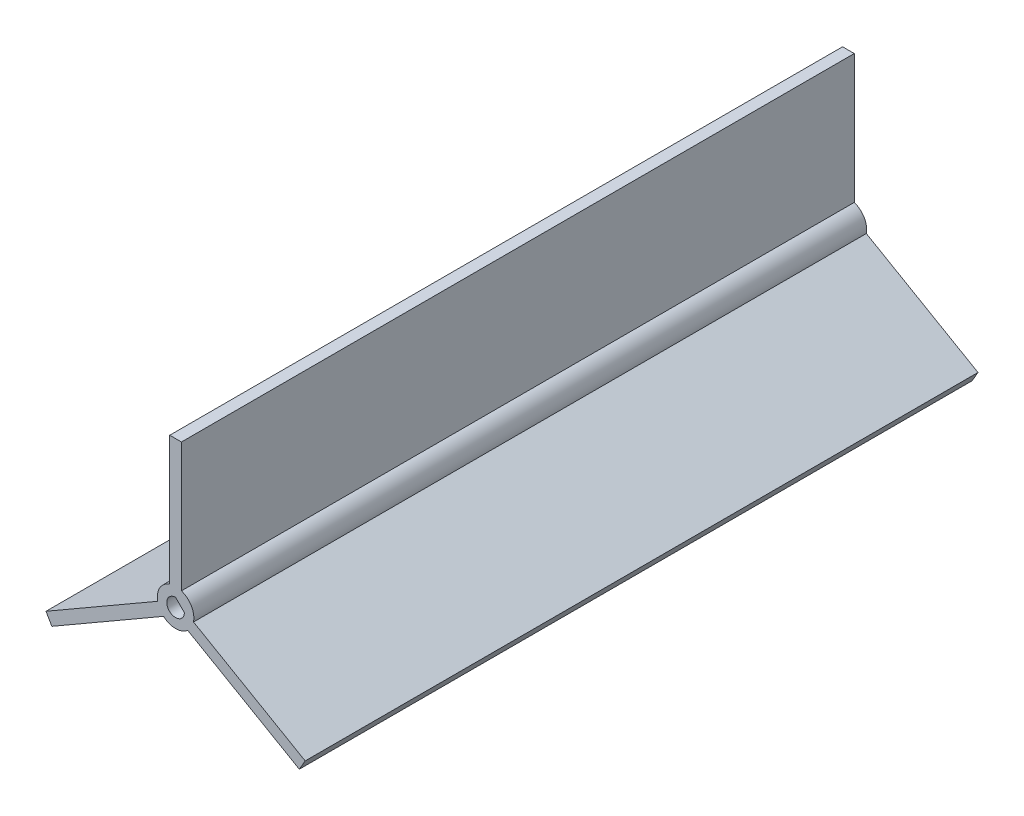
ISO-10303-21;
HEADER;
FILE_DESCRIPTION(('STEP AP214'),'2;1');
FILE_NAME('part.step','',(''),(''),'','','');
FILE_SCHEMA(('AUTOMOTIVE_DESIGN { 1 0 10303 214 1 1 1 1 }'));
ENDSEC;
DATA;
#1=APPLICATION_CONTEXT('core data for automotive mechanical design processes');
#2=APPLICATION_PROTOCOL_DEFINITION('international standard','automotive_design',2000,#1);
#3=PRODUCT_CONTEXT('',#1,'mechanical');
#4=PRODUCT('Part','Part','',(#3));
#5=PRODUCT_RELATED_PRODUCT_CATEGORY('part','',(#4));
#6=PRODUCT_DEFINITION_FORMATION('','',#4);
#7=PRODUCT_DEFINITION_CONTEXT('part definition',#1,'design');
#8=PRODUCT_DEFINITION('design','',#6,#7);
#9=PRODUCT_DEFINITION_SHAPE('','',#8);
#10=(LENGTH_UNIT() NAMED_UNIT(*) SI_UNIT(.MILLI.,.METRE.));
#11=(NAMED_UNIT(*) PLANE_ANGLE_UNIT() SI_UNIT($,.RADIAN.));
#12=(NAMED_UNIT(*) SI_UNIT($,.STERADIAN.) SOLID_ANGLE_UNIT());
#13=UNCERTAINTY_MEASURE_WITH_UNIT(LENGTH_MEASURE(1.E-05),#10,'distance_accuracy_value','');
#14=(GEOMETRIC_REPRESENTATION_CONTEXT(3) GLOBAL_UNCERTAINTY_ASSIGNED_CONTEXT((#13)) GLOBAL_UNIT_ASSIGNED_CONTEXT((#10,
#11,#12)) REPRESENTATION_CONTEXT('',''));
#15=CARTESIAN_POINT('',(0.,0.,0.));
#16=DIRECTION('',(0.,0.,1.));
#17=DIRECTION('',(1.,0.,0.));
#18=AXIS2_PLACEMENT_3D('',#15,#16,#17);
#19=CARTESIAN_POINT('',(-1.27000000000001,2.19970452561247,292.1));
#20=DIRECTION('',(0.500000000000004,-0.866025403784436,0.));
#21=DIRECTION('',(0.866025403784436,0.500000000000004,0.));
#22=AXIS2_PLACEMENT_3D('',#19,#20,#21);
#23=PLANE('',#22);
#24=DIRECTION('',(-0.866025403784436,-0.500000000000004,0.));
#25=VECTOR('',#24,1.);
#26=CARTESIAN_POINT('',(-1.27000000000001,2.19970452561247,0.));
#27=LINE('',#26,#25);
#28=CARTESIAN_POINT('',(-7.7826208002232,-1.56035884652639,0.));
#29=VERTEX_POINT('',#28);
#30=CARTESIAN_POINT('',(-56.2626131403117,-29.5502954743878,0.));
#31=VERTEX_POINT('',#30);
#32=EDGE_CURVE('E158',#29,#31,#27,.T.);
#33=ORIENTED_EDGE('',*,*,#32,.T.);
#34=DIRECTION('',(0.,0.,-1.));
#35=VECTOR('',#34,1.);
#36=CARTESIAN_POINT('',(-56.2626131403117,-29.5502954743878,292.1));
#37=LINE('',#36,#35);
#38=CARTESIAN_POINT('',(-56.2626131403117,-29.5502954743878,292.1));
#39=VERTEX_POINT('',#38);
#40=EDGE_CURVE('E11',#39,#31,#37,.T.);
#41=ORIENTED_EDGE('',*,*,#40,.F.);
#42=DIRECTION('',(-0.866025403784436,-0.500000000000004,0.));
#43=VECTOR('',#42,1.);
#44=CARTESIAN_POINT('',(-1.27000000000001,2.19970452561247,292.1));
#45=LINE('',#44,#43);
#46=CARTESIAN_POINT('',(-7.7826208002232,-1.56035884652639,292.1));
#47=VERTEX_POINT('',#46);
#48=EDGE_CURVE('E152',#47,#39,#45,.T.);
#49=ORIENTED_EDGE('',*,*,#48,.F.);
#50=DIRECTION('',(0.,0.,-1.));
#51=VECTOR('',#50,1.);
#52=CARTESIAN_POINT('',(-7.7826208002232,-1.56035884652639,292.1));
#53=LINE('',#52,#51);
#54=EDGE_CURVE('E146',#47,#29,#53,.T.);
#55=ORIENTED_EDGE('',*,*,#54,.T.);
#56=EDGE_LOOP('',(#33,#41,#49,#55));
#57=FACE_BOUND('',#56,.T.);
#58=ADVANCED_FACE('F36',(#57),#23,.F.);
#59=CARTESIAN_POINT('',(-54.9926131403117,-31.7500000000004,292.1));
#60=DIRECTION('',(0.866025403784436,0.500000000000005,0.));
#61=DIRECTION('',(-0.500000000000005,0.866025403784436,0.));
#62=AXIS2_PLACEMENT_3D('',#59,#60,#61);
#63=PLANE('',#62);
#64=DIRECTION('',(0.500000000000005,-0.866025403784436,0.));
#65=VECTOR('',#64,1.);
#66=CARTESIAN_POINT('',(-54.9926131403117,-31.7500000000004,0.));
#67=LINE('',#66,#65);
#68=CARTESIAN_POINT('',(-53.7226131403117,-33.9497045256128,0.));
#69=VERTEX_POINT('',#68);
#70=EDGE_CURVE('E165',#31,#69,#67,.T.);
#71=ORIENTED_EDGE('',*,*,#70,.T.);
#72=DIRECTION('',(0.,0.,-1.));
#73=VECTOR('',#72,1.);
#74=CARTESIAN_POINT('',(-53.7226131403117,-33.9497045256128,292.1));
#75=LINE('',#74,#73);
#76=CARTESIAN_POINT('',(-53.7226131403117,-33.9497045256128,292.1));
#77=VERTEX_POINT('',#76);
#78=EDGE_CURVE('E44',#77,#69,#75,.T.);
#79=ORIENTED_EDGE('',*,*,#78,.F.);
#80=DIRECTION('',(0.500000000000005,-0.866025403784436,0.));
#81=VECTOR('',#80,1.);
#82=CARTESIAN_POINT('',(-54.9926131403117,-31.7500000000004,292.1));
#83=LINE('',#82,#81);
#84=EDGE_CURVE('E220',#39,#77,#83,.T.);
#85=ORIENTED_EDGE('',*,*,#84,.F.);
#86=ORIENTED_EDGE('',*,*,#40,.T.);
#87=EDGE_LOOP('',(#71,#79,#85,#86));
#88=FACE_BOUND('',#87,.T.);
#89=ADVANCED_FACE('F286',(#88),#63,.F.);
#90=CARTESIAN_POINT('',(1.27000000000001,-2.19970452561247,292.1));
#91=DIRECTION('',(0.500000000000004,-0.866025403784436,0.));
#92=DIRECTION('',(0.866025403784436,0.500000000000004,0.));
#93=AXIS2_PLACEMENT_3D('',#90,#91,#92);
#94=PLANE('',#93);
#95=DIRECTION('',(-0.866025403784436,-0.500000000000004,0.));
#96=VECTOR('',#95,1.);
#97=CARTESIAN_POINT('',(1.27000000000001,-2.19970452561247,0.));
#98=LINE('',#97,#96);
#99=CARTESIAN_POINT('',(-5.24262080022318,-5.95976789775133,0.));
#100=VERTEX_POINT('',#99);
#101=EDGE_CURVE('E167',#100,#69,#98,.T.);
#102=ORIENTED_EDGE('',*,*,#101,.F.);
#103=DIRECTION('',(0.,0.,-1.));
#104=VECTOR('',#103,1.);
#105=CARTESIAN_POINT('',(-5.24262080022318,-5.95976789775133,292.1));
#106=LINE('',#105,#104);
#107=CARTESIAN_POINT('',(-5.24262080022318,-5.95976789775133,292.1));
#108=VERTEX_POINT('',#107);
#109=EDGE_CURVE('E210',#108,#100,#106,.T.);
#110=ORIENTED_EDGE('',*,*,#109,.F.);
#111=DIRECTION('',(-0.866025403784436,-0.500000000000004,0.));
#112=VECTOR('',#111,1.);
#113=CARTESIAN_POINT('',(1.27000000000001,-2.19970452561247,292.1));
#114=LINE('',#113,#112);
#115=EDGE_CURVE('E222',#108,#77,#114,.T.);
#116=ORIENTED_EDGE('',*,*,#115,.T.);
#117=ORIENTED_EDGE('',*,*,#78,.T.);
#118=EDGE_LOOP('',(#102,#110,#116,#117));
#119=FACE_BOUND('',#118,.T.);
#120=ADVANCED_FACE('F283',(#119),#94,.T.);
#121=CARTESIAN_POINT('',(0.,0.,292.1));
#122=DIRECTION('',(0.,0.,-1.));
#123=DIRECTION('',(-1.,0.,0.));
#124=AXIS2_PLACEMENT_3D('',#121,#122,#123);
#125=CYLINDRICAL_SURFACE('',#124,7.9375);
#126=CARTESIAN_POINT('',(0.,0.,0.));
#127=DIRECTION('',(0.,0.,1.));
#128=DIRECTION('',(1.,0.,0.));
#129=AXIS2_PLACEMENT_3D('',#126,#127,#128);
#130=CIRCLE('',#129,7.9375);
#131=CARTESIAN_POINT('',(5.24262080022318,-5.95976789775133,0.));
#132=VERTEX_POINT('',#131);
#133=EDGE_CURVE('E173',#100,#132,#130,.T.);
#134=ORIENTED_EDGE('',*,*,#133,.T.);
#135=DIRECTION('',(0.,0.,-1.));
#136=VECTOR('',#135,1.);
#137=CARTESIAN_POINT('',(5.24262080022318,-5.95976789775133,292.1));
#138=LINE('',#137,#136);
#139=CARTESIAN_POINT('',(5.24262080022318,-5.95976789775133,292.1));
#140=VERTEX_POINT('',#139);
#141=EDGE_CURVE('E207',#140,#132,#138,.T.);
#142=ORIENTED_EDGE('',*,*,#141,.F.);
#143=CARTESIAN_POINT('',(0.,0.,292.1));
#144=DIRECTION('',(0.,0.,1.));
#145=DIRECTION('',(1.,0.,0.));
#146=AXIS2_PLACEMENT_3D('',#143,#144,#145);
#147=CIRCLE('',#146,7.9375);
#148=EDGE_CURVE('E225',#108,#140,#147,.T.);
#149=ORIENTED_EDGE('',*,*,#148,.F.);
#150=ORIENTED_EDGE('',*,*,#109,.T.);
#151=EDGE_LOOP('',(#134,#142,#149,#150));
#152=FACE_BOUND('',#151,.T.);
#153=ADVANCED_FACE('F279',(#152),#125,.T.);
#154=CARTESIAN_POINT('',(-1.27000000000001,-2.19970452561247,292.1));
#155=DIRECTION('',(0.500000000000004,0.866025403784436,0.));
#156=DIRECTION('',(-0.866025403784436,0.500000000000004,0.));
#157=AXIS2_PLACEMENT_3D('',#154,#155,#156);
#158=PLANE('',#157);
#159=DIRECTION('',(0.866025403784436,-0.500000000000004,0.));
#160=VECTOR('',#159,1.);
#161=CARTESIAN_POINT('',(-1.27000000000001,-2.19970452561247,0.));
#162=LINE('',#161,#160);
#163=CARTESIAN_POINT('',(53.7226131403117,-33.9497045256127,0.));
#164=VERTEX_POINT('',#163);
#165=EDGE_CURVE('E175',#132,#164,#162,.T.);
#166=ORIENTED_EDGE('',*,*,#165,.T.);
#167=DIRECTION('',(0.,0.,-1.));
#168=VECTOR('',#167,1.);
#169=CARTESIAN_POINT('',(53.7226131403117,-33.9497045256127,292.1));
#170=LINE('',#169,#168);
#171=CARTESIAN_POINT('',(53.7226131403117,-33.9497045256127,292.1));
#172=VERTEX_POINT('',#171);
#173=EDGE_CURVE('E205',#172,#164,#170,.T.);
#174=ORIENTED_EDGE('',*,*,#173,.F.);
#175=DIRECTION('',(0.866025403784436,-0.500000000000004,0.));
#176=VECTOR('',#175,1.);
#177=CARTESIAN_POINT('',(-1.27000000000001,-2.19970452561247,292.1));
#178=LINE('',#177,#176);
#179=EDGE_CURVE('E227',#140,#172,#178,.T.);
#180=ORIENTED_EDGE('',*,*,#179,.F.);
#181=ORIENTED_EDGE('',*,*,#141,.T.);
#182=EDGE_LOOP('',(#166,#174,#180,#181));
#183=FACE_BOUND('',#182,.T.);
#184=ADVANCED_FACE('F275',(#183),#158,.F.);
#185=CARTESIAN_POINT('',(54.9926131403117,-31.7500000000002,292.1));
#186=DIRECTION('',(0.866025403784437,-0.500000000000003,0.));
#187=DIRECTION('',(0.500000000000003,0.866025403784437,0.));
#188=AXIS2_PLACEMENT_3D('',#185,#186,#187);
#189=PLANE('',#188);
#190=DIRECTION('',(-0.500000000000003,-0.866025403784437,0.));
#191=VECTOR('',#190,1.);
#192=CARTESIAN_POINT('',(54.9926131403117,-31.7500000000002,0.));
#193=LINE('',#192,#191);
#194=CARTESIAN_POINT('',(56.2626131403117,-29.5502954743878,0.));
#195=VERTEX_POINT('',#194);
#196=EDGE_CURVE('E178',#195,#164,#193,.T.);
#197=ORIENTED_EDGE('',*,*,#196,.F.);
#198=DIRECTION('',(0.,0.,-1.));
#199=VECTOR('',#198,1.);
#200=CARTESIAN_POINT('',(56.2626131403117,-29.5502954743878,292.1));
#201=LINE('',#200,#199);
#202=CARTESIAN_POINT('',(56.2626131403117,-29.5502954743878,292.1));
#203=VERTEX_POINT('',#202);
#204=EDGE_CURVE('E203',#203,#195,#201,.T.);
#205=ORIENTED_EDGE('',*,*,#204,.F.);
#206=DIRECTION('',(-0.500000000000003,-0.866025403784437,0.));
#207=VECTOR('',#206,1.);
#208=CARTESIAN_POINT('',(54.9926131403117,-31.7500000000002,292.1));
#209=LINE('',#208,#207);
#210=EDGE_CURVE('E229',#203,#172,#209,.T.);
#211=ORIENTED_EDGE('',*,*,#210,.T.);
#212=ORIENTED_EDGE('',*,*,#173,.T.);
#213=EDGE_LOOP('',(#197,#205,#211,#212));
#214=FACE_BOUND('',#213,.T.);
#215=ADVANCED_FACE('F270',(#214),#189,.T.);
#216=CARTESIAN_POINT('',(1.27000000000001,2.19970452561247,292.1));
#217=DIRECTION('',(0.500000000000004,0.866025403784436,0.));
#218=DIRECTION('',(-0.866025403784436,0.500000000000004,0.));
#219=AXIS2_PLACEMENT_3D('',#216,#217,#218);
#220=PLANE('',#219);
#221=DIRECTION('',(0.866025403784436,-0.500000000000004,0.));
#222=VECTOR('',#221,1.);
#223=CARTESIAN_POINT('',(1.27000000000001,2.19970452561247,0.));
#224=LINE('',#223,#222);
#225=CARTESIAN_POINT('',(7.7826208002232,-1.56035884652639,0.));
#226=VERTEX_POINT('',#225);
#227=EDGE_CURVE('E181',#226,#195,#224,.T.);
#228=ORIENTED_EDGE('',*,*,#227,.F.);
#229=DIRECTION('',(0.,0.,-1.));
#230=VECTOR('',#229,1.);
#231=CARTESIAN_POINT('',(7.7826208002232,-1.56035884652639,292.1));
#232=LINE('',#231,#230);
#233=CARTESIAN_POINT('',(7.7826208002232,-1.56035884652639,292.1));
#234=VERTEX_POINT('',#233);
#235=EDGE_CURVE('E201',#234,#226,#232,.T.);
#236=ORIENTED_EDGE('',*,*,#235,.F.);
#237=DIRECTION('',(0.866025403784436,-0.500000000000004,0.));
#238=VECTOR('',#237,1.);
#239=CARTESIAN_POINT('',(1.27000000000001,2.19970452561247,292.1));
#240=LINE('',#239,#238);
#241=EDGE_CURVE('E232',#234,#203,#240,.T.);
#242=ORIENTED_EDGE('',*,*,#241,.T.);
#243=ORIENTED_EDGE('',*,*,#204,.T.);
#244=EDGE_LOOP('',(#228,#236,#242,#243));
#245=FACE_BOUND('',#244,.T.);
#246=ADVANCED_FACE('F265',(#245),#220,.T.);
#247=CARTESIAN_POINT('',(0.,0.,292.1));
#248=DIRECTION('',(0.,0.,-1.));
#249=DIRECTION('',(-1.,0.,0.));
#250=AXIS2_PLACEMENT_3D('',#247,#248,#249);
#251=CYLINDRICAL_SURFACE('',#250,7.9375);
#252=CARTESIAN_POINT('',(0.,0.,0.));
#253=DIRECTION('',(0.,0.,1.));
#254=DIRECTION('',(1.,0.,0.));
#255=AXIS2_PLACEMENT_3D('',#252,#253,#254);
#256=CIRCLE('',#255,7.9375);
#257=CARTESIAN_POINT('',(2.54,7.52012674427765,0.));
#258=VERTEX_POINT('',#257);
#259=EDGE_CURVE('E184',#226,#258,#256,.T.);
#260=ORIENTED_EDGE('',*,*,#259,.T.);
#261=DIRECTION('',(0.,0.,-1.));
#262=VECTOR('',#261,1.);
#263=CARTESIAN_POINT('',(2.54,7.52012674427765,292.1));
#264=LINE('',#263,#262);
#265=CARTESIAN_POINT('',(2.54,7.52012674427765,292.1));
#266=VERTEX_POINT('',#265);
#267=EDGE_CURVE('E198',#266,#258,#264,.T.);
#268=ORIENTED_EDGE('',*,*,#267,.F.);
#269=CARTESIAN_POINT('',(0.,0.,292.1));
#270=DIRECTION('',(0.,0.,1.));
#271=DIRECTION('',(1.,0.,0.));
#272=AXIS2_PLACEMENT_3D('',#269,#270,#271);
#273=CIRCLE('',#272,7.9375);
#274=EDGE_CURVE('E235',#234,#266,#273,.T.);
#275=ORIENTED_EDGE('',*,*,#274,.F.);
#276=ORIENTED_EDGE('',*,*,#235,.T.);
#277=EDGE_LOOP('',(#260,#268,#275,#276));
#278=FACE_BOUND('',#277,.T.);
#279=ADVANCED_FACE('F262',(#278),#251,.T.);
#280=CARTESIAN_POINT('',(2.54,0.,292.1));
#281=DIRECTION('',(-1.,0.,0.));
#282=DIRECTION('',(0.,-1.,0.));
#283=AXIS2_PLACEMENT_3D('',#280,#281,#282);
#284=PLANE('',#283);
#285=DIRECTION('',(0.,1.,0.));
#286=VECTOR('',#285,1.);
#287=CARTESIAN_POINT('',(2.54,0.,0.));
#288=LINE('',#287,#286);
#289=CARTESIAN_POINT('',(2.54,63.5,0.));
#290=VERTEX_POINT('',#289);
#291=EDGE_CURVE('E186',#258,#290,#288,.T.);
#292=ORIENTED_EDGE('',*,*,#291,.T.);
#293=DIRECTION('',(0.,0.,-1.));
#294=VECTOR('',#293,1.);
#295=CARTESIAN_POINT('',(2.54,63.5,292.1));
#296=LINE('',#295,#294);
#297=CARTESIAN_POINT('',(2.54,63.5,292.1));
#298=VERTEX_POINT('',#297);
#299=EDGE_CURVE('E196',#298,#290,#296,.T.);
#300=ORIENTED_EDGE('',*,*,#299,.F.);
#301=DIRECTION('',(0.,1.,0.));
#302=VECTOR('',#301,1.);
#303=CARTESIAN_POINT('',(2.54,0.,292.1));
#304=LINE('',#303,#302);
#305=EDGE_CURVE('E237',#266,#298,#304,.T.);
#306=ORIENTED_EDGE('',*,*,#305,.F.);
#307=ORIENTED_EDGE('',*,*,#267,.T.);
#308=EDGE_LOOP('',(#292,#300,#306,#307));
#309=FACE_BOUND('',#308,.T.);
#310=ADVANCED_FACE('F258',(#309),#284,.F.);
#311=CARTESIAN_POINT('',(0.,63.5,292.1));
#312=DIRECTION('',(0.,1.,0.));
#313=DIRECTION('',(0.,0.,1.));
#314=AXIS2_PLACEMENT_3D('',#311,#312,#313);
#315=PLANE('',#314);
#316=DIRECTION('',(1.,0.,0.));
#317=VECTOR('',#316,1.);
#318=CARTESIAN_POINT('',(0.,63.5,0.));
#319=LINE('',#318,#317);
#320=CARTESIAN_POINT('',(-2.54,63.5,0.));
#321=VERTEX_POINT('',#320);
#322=EDGE_CURVE('E189',#321,#290,#319,.T.);
#323=ORIENTED_EDGE('',*,*,#322,.F.);
#324=DIRECTION('',(0.,0.,-1.));
#325=VECTOR('',#324,1.);
#326=CARTESIAN_POINT('',(-2.54,63.5,292.1));
#327=LINE('',#326,#325);
#328=CARTESIAN_POINT('',(-2.54,63.5,292.1));
#329=VERTEX_POINT('',#328);
#330=EDGE_CURVE('E194',#329,#321,#327,.T.);
#331=ORIENTED_EDGE('',*,*,#330,.F.);
#332=DIRECTION('',(1.,0.,0.));
#333=VECTOR('',#332,1.);
#334=CARTESIAN_POINT('',(0.,63.5,292.1));
#335=LINE('',#334,#333);
#336=EDGE_CURVE('E239',#329,#298,#335,.T.);
#337=ORIENTED_EDGE('',*,*,#336,.T.);
#338=ORIENTED_EDGE('',*,*,#299,.T.);
#339=EDGE_LOOP('',(#323,#331,#337,#338));
#340=FACE_BOUND('',#339,.T.);
#341=ADVANCED_FACE('F252',(#340),#315,.T.);
#342=CARTESIAN_POINT('',(-2.54,0.,292.1));
#343=DIRECTION('',(-1.,0.,0.));
#344=DIRECTION('',(0.,0.,1.));
#345=AXIS2_PLACEMENT_3D('',#342,#343,#344);
#346=PLANE('',#345);
#347=DIRECTION('',(0.,1.,0.));
#348=VECTOR('',#347,1.);
#349=CARTESIAN_POINT('',(-2.54,0.,0.));
#350=LINE('',#349,#348);
#351=CARTESIAN_POINT('',(-2.54,7.52012674427765,0.));
#352=VERTEX_POINT('',#351);
#353=EDGE_CURVE('E153',#352,#321,#350,.T.);
#354=ORIENTED_EDGE('',*,*,#353,.F.);
#355=DIRECTION('',(0.,0.,-1.));
#356=VECTOR('',#355,1.);
#357=CARTESIAN_POINT('',(-2.54,7.52012674427765,292.1));
#358=LINE('',#357,#356);
#359=CARTESIAN_POINT('',(-2.54,7.52012674427765,292.1));
#360=VERTEX_POINT('',#359);
#361=EDGE_CURVE('E140',#360,#352,#358,.T.);
#362=ORIENTED_EDGE('',*,*,#361,.F.);
#363=DIRECTION('',(0.,1.,0.));
#364=VECTOR('',#363,1.);
#365=CARTESIAN_POINT('',(-2.54,0.,292.1));
#366=LINE('',#365,#364);
#367=EDGE_CURVE('E241',#360,#329,#366,.T.);
#368=ORIENTED_EDGE('',*,*,#367,.T.);
#369=ORIENTED_EDGE('',*,*,#330,.T.);
#370=EDGE_LOOP('',(#354,#362,#368,#369));
#371=FACE_BOUND('',#370,.T.);
#372=ADVANCED_FACE('F253',(#371),#346,.T.);
#373=CARTESIAN_POINT('',(0.,0.,292.1));
#374=DIRECTION('',(0.,0.,-1.));
#375=DIRECTION('',(-1.,0.,0.));
#376=AXIS2_PLACEMENT_3D('',#373,#374,#375);
#377=CYLINDRICAL_SURFACE('',#376,7.9375);
#378=CARTESIAN_POINT('',(0.,0.,0.));
#379=DIRECTION('',(0.,0.,1.));
#380=DIRECTION('',(1.,0.,0.));
#381=AXIS2_PLACEMENT_3D('',#378,#379,#380);
#382=CIRCLE('',#381,7.9375);
#383=EDGE_CURVE('E143',#352,#29,#382,.T.);
#384=ORIENTED_EDGE('',*,*,#383,.T.);
#385=ORIENTED_EDGE('',*,*,#54,.F.);
#386=CARTESIAN_POINT('',(0.,0.,292.1));
#387=DIRECTION('',(0.,0.,1.));
#388=DIRECTION('',(1.,0.,0.));
#389=AXIS2_PLACEMENT_3D('',#386,#387,#388);
#390=CIRCLE('',#389,7.9375);
#391=EDGE_CURVE('E160',#360,#47,#390,.T.);
#392=ORIENTED_EDGE('',*,*,#391,.F.);
#393=ORIENTED_EDGE('',*,*,#361,.T.);
#394=EDGE_LOOP('',(#384,#385,#392,#393));
#395=FACE_BOUND('',#394,.T.);
#396=ADVANCED_FACE('F145',(#395),#377,.T.);
#397=CARTESIAN_POINT('',(0.,0.,292.1));
#398=DIRECTION('',(0.,0.,1.));
#399=DIRECTION('',(1.,0.,0.));
#400=AXIS2_PLACEMENT_3D('',#397,#398,#399);
#401=PLANE('',#400);
#402=CARTESIAN_POINT('',(0.,0.,292.1));
#403=DIRECTION('',(0.,0.,1.));
#404=DIRECTION('',(1.,0.,0.));
#405=AXIS2_PLACEMENT_3D('',#402,#403,#404);
#406=CIRCLE('',#405,3.81);
#407=CARTESIAN_POINT('',(0.,3.81,292.1));
#408=VERTEX_POINT('',#407);
#409=CARTESIAN_POINT('',(3.81,0.,292.1));
#410=VERTEX_POINT('',#409);
#411=EDGE_CURVE('E39',#408,#410,#406,.T.);
#412=ORIENTED_EDGE('',*,*,#411,.F.);
#413=DIRECTION('',(-0.707106781186548,0.707106781186548,0.));
#414=VECTOR('',#413,1.);
#415=CARTESIAN_POINT('',(0.,3.81,292.1));
#416=LINE('',#415,#414);
#417=EDGE_CURVE('E72',#410,#408,#416,.T.);
#418=ORIENTED_EDGE('',*,*,#417,.F.);
#419=EDGE_LOOP('',(#412,#418));
#420=FACE_BOUND('',#419,.T.);
#421=ORIENTED_EDGE('',*,*,#48,.T.);
#422=ORIENTED_EDGE('',*,*,#84,.T.);
#423=ORIENTED_EDGE('',*,*,#115,.F.);
#424=ORIENTED_EDGE('',*,*,#148,.T.);
#425=ORIENTED_EDGE('',*,*,#179,.T.);
#426=ORIENTED_EDGE('',*,*,#210,.F.);
#427=ORIENTED_EDGE('',*,*,#241,.F.);
#428=ORIENTED_EDGE('',*,*,#274,.T.);
#429=ORIENTED_EDGE('',*,*,#305,.T.);
#430=ORIENTED_EDGE('',*,*,#336,.F.);
#431=ORIENTED_EDGE('',*,*,#367,.F.);
#432=ORIENTED_EDGE('',*,*,#391,.T.);
#433=EDGE_LOOP('',(#421,#422,#423,#424,#425,#426,#427,#428,#429,#430,#431,#432));
#434=FACE_BOUND('',#433,.T.);
#435=ADVANCED_FACE('F246',(#420,#434),#401,.T.);
#436=CARTESIAN_POINT('',(0.,0.,0.));
#437=DIRECTION('',(0.,0.,1.));
#438=DIRECTION('',(1.,0.,0.));
#439=AXIS2_PLACEMENT_3D('',#436,#437,#438);
#440=PLANE('',#439);
#441=DIRECTION('',(-0.707106781186547,0.707106781186547,0.));
#442=VECTOR('',#441,1.);
#443=CARTESIAN_POINT('',(0.,3.81,0.));
#444=LINE('',#443,#442);
#445=CARTESIAN_POINT('',(3.81,0.,0.));
#446=VERTEX_POINT('',#445);
#447=CARTESIAN_POINT('',(0.,3.81,0.));
#448=VERTEX_POINT('',#447);
#449=EDGE_CURVE('E215',#446,#448,#444,.T.);
#450=ORIENTED_EDGE('',*,*,#449,.T.);
#451=CARTESIAN_POINT('',(0.,0.,0.));
#452=DIRECTION('',(0.,0.,1.));
#453=DIRECTION('',(1.,0.,0.));
#454=AXIS2_PLACEMENT_3D('',#451,#452,#453);
#455=CIRCLE('',#454,3.81);
#456=EDGE_CURVE('E60',#448,#446,#455,.T.);
#457=ORIENTED_EDGE('',*,*,#456,.T.);
#458=EDGE_LOOP('',(#450,#457));
#459=FACE_BOUND('',#458,.T.);
#460=ORIENTED_EDGE('',*,*,#32,.F.);
#461=ORIENTED_EDGE('',*,*,#383,.F.);
#462=ORIENTED_EDGE('',*,*,#353,.T.);
#463=ORIENTED_EDGE('',*,*,#322,.T.);
#464=ORIENTED_EDGE('',*,*,#291,.F.);
#465=ORIENTED_EDGE('',*,*,#259,.F.);
#466=ORIENTED_EDGE('',*,*,#227,.T.);
#467=ORIENTED_EDGE('',*,*,#196,.T.);
#468=ORIENTED_EDGE('',*,*,#165,.F.);
#469=ORIENTED_EDGE('',*,*,#133,.F.);
#470=ORIENTED_EDGE('',*,*,#101,.T.);
#471=ORIENTED_EDGE('',*,*,#70,.F.);
#472=EDGE_LOOP('',(#460,#461,#462,#463,#464,#465,#466,#467,#468,#469,#470,#471));
#473=FACE_BOUND('',#472,.T.);
#474=ADVANCED_FACE('F162',(#459,#473),#440,.F.);
#475=CARTESIAN_POINT('',(0.,0.,0.));
#476=DIRECTION('',(0.,0.,1.));
#477=DIRECTION('',(1.,0.,0.));
#478=AXIS2_PLACEMENT_3D('',#475,#476,#477);
#479=CYLINDRICAL_SURFACE('',#478,3.81);
#480=ORIENTED_EDGE('',*,*,#411,.T.);
#481=DIRECTION('',(0.,0.,1.));
#482=VECTOR('',#481,1.);
#483=CARTESIAN_POINT('',(3.81,0.,0.));
#484=LINE('',#483,#482);
#485=EDGE_CURVE('E52',#446,#410,#484,.T.);
#486=ORIENTED_EDGE('',*,*,#485,.F.);
#487=ORIENTED_EDGE('',*,*,#456,.F.);
#488=DIRECTION('',(0.,0.,1.));
#489=VECTOR('',#488,1.);
#490=CARTESIAN_POINT('',(0.,3.81,0.));
#491=LINE('',#490,#489);
#492=EDGE_CURVE('E212',#448,#408,#491,.T.);
#493=ORIENTED_EDGE('',*,*,#492,.T.);
#494=EDGE_LOOP('',(#480,#486,#487,#493));
#495=FACE_BOUND('',#494,.T.);
#496=ADVANCED_FACE('F314',(#495),#479,.F.);
#497=CARTESIAN_POINT('',(0.,3.81,0.));
#498=DIRECTION('',(0.707106781186548,0.707106781186548,0.));
#499=DIRECTION('',(-0.707106781186548,0.707106781186548,0.));
#500=AXIS2_PLACEMENT_3D('',#497,#498,#499);
#501=PLANE('',#500);
#502=ORIENTED_EDGE('',*,*,#417,.T.);
#503=ORIENTED_EDGE('',*,*,#492,.F.);
#504=ORIENTED_EDGE('',*,*,#449,.F.);
#505=ORIENTED_EDGE('',*,*,#485,.T.);
#506=EDGE_LOOP('',(#502,#503,#504,#505));
#507=FACE_BOUND('',#506,.T.);
#508=ADVANCED_FACE('F321',(#507),#501,.F.);
#509=CLOSED_SHELL('',(#58,#89,#120,#153,#184,#215,#246,#279,#310,#341,#372,#396,#435,#474,#496,#508));
#510=MANIFOLD_SOLID_BREP('B2',#509);
#511=ADVANCED_BREP_SHAPE_REPRESENTATION('',(#18,#510),#14);
#512=SHAPE_DEFINITION_REPRESENTATION(#9,#511);
ENDSEC;
END-ISO-10303-21;
